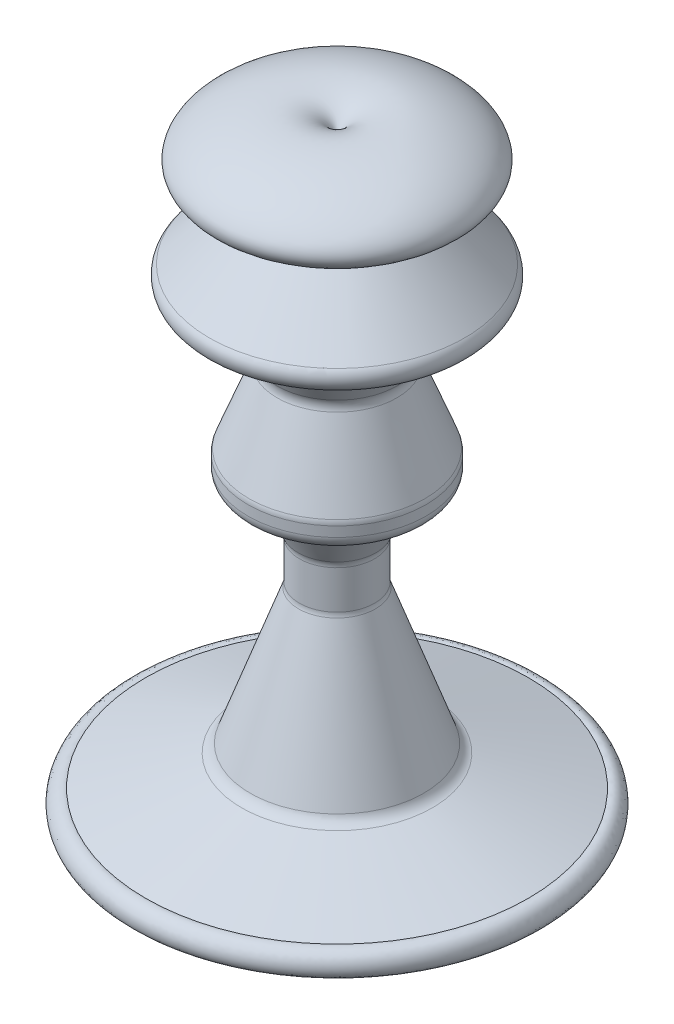
ISO-10303-21;
HEADER;
FILE_DESCRIPTION(('STEP AP214'),'2;1');
FILE_NAME('part.step','',(''),(''),'','','');
FILE_SCHEMA(('AUTOMOTIVE_DESIGN { 1 0 10303 214 1 1 1 1 }'));
ENDSEC;
DATA;
#1=APPLICATION_CONTEXT('core data for automotive mechanical design processes');
#2=APPLICATION_PROTOCOL_DEFINITION('international standard','automotive_design',2000,#1);
#3=PRODUCT_CONTEXT('',#1,'mechanical');
#4=PRODUCT('Part','Part','',(#3));
#5=PRODUCT_RELATED_PRODUCT_CATEGORY('part','',(#4));
#6=PRODUCT_DEFINITION_FORMATION('','',#4);
#7=PRODUCT_DEFINITION_CONTEXT('part definition',#1,'design');
#8=PRODUCT_DEFINITION('design','',#6,#7);
#9=PRODUCT_DEFINITION_SHAPE('','',#8);
#10=(LENGTH_UNIT() NAMED_UNIT(*) SI_UNIT(.MILLI.,.METRE.));
#11=(NAMED_UNIT(*) PLANE_ANGLE_UNIT() SI_UNIT($,.RADIAN.));
#12=(NAMED_UNIT(*) SI_UNIT($,.STERADIAN.) SOLID_ANGLE_UNIT());
#13=UNCERTAINTY_MEASURE_WITH_UNIT(LENGTH_MEASURE(1.E-05),#10,'distance_accuracy_value','');
#14=(GEOMETRIC_REPRESENTATION_CONTEXT(3) GLOBAL_UNCERTAINTY_ASSIGNED_CONTEXT((#13)) GLOBAL_UNIT_ASSIGNED_CONTEXT((#10,
#11,#12)) REPRESENTATION_CONTEXT('',''));
#15=CARTESIAN_POINT('',(0.,0.,0.));
#16=DIRECTION('',(0.,0.,1.));
#17=DIRECTION('',(1.,0.,0.));
#18=AXIS2_PLACEMENT_3D('',#15,#16,#17);
#19=CARTESIAN_POINT('',(12.3714239352477,37.0452322776149,0.));
#20=CARTESIAN_POINT('',(41.0183558371636,39.0587209242621,0.));
#21=CARTESIAN_POINT('',(4.95496067158037,58.3208453663256,0.));
#22=CARTESIAN_POINT('',(0.,45.2019806690164,0.));
#23=B_SPLINE_CURVE_WITH_KNOTS('',3,(#19,#20,#21,#22),.UNSPECIFIED.,.F.,.F.,(4,4),(0.,1.),.UNSPECIFIED.);
#24=CARTESIAN_POINT('',(0.,45.2019806690164,0.));
#25=DIRECTION('',(0.,1.,0.));
#26=AXIS1_PLACEMENT('',#24,#25);
#27=SURFACE_OF_REVOLUTION('',#23,#26);
#28=CARTESIAN_POINT('',(0.,45.2019806690164,0.));
#29=VERTEX_POINT('',#28);
#30=VERTEX_LOOP('',#29);
#31=FACE_BOUND('',#30,.T.);
#32=CARTESIAN_POINT('',(0.,37.0452322776149,0.));
#33=DIRECTION('',(0.,1.,0.));
#34=DIRECTION('',(0.,0.,1.));
#35=AXIS2_PLACEMENT_3D('',#32,#33,#34);
#36=CIRCLE('',#35,12.3714239352477);
#37=CARTESIAN_POINT('',(0.,37.0452322776149,12.3714239352477));
#38=VERTEX_POINT('',#37);
#39=EDGE_CURVE('E49',#38,#38,#36,.T.);
#40=ORIENTED_EDGE('',*,*,#39,.T.);
#41=EDGE_LOOP('',(#40));
#42=FACE_BOUND('',#41,.T.);
#43=ADVANCED_FACE('F33',(#31,#42),#27,.T.);
#44=CARTESIAN_POINT('',(0.,21.3601045228713,0.));
#45=DIRECTION('',(0.,-1.,0.));
#46=DIRECTION('',(0.,0.,-1.));
#47=AXIS2_PLACEMENT_3D('',#44,#45,#46);
#48=CONICAL_SURFACE('',#47,27.0882518979269,0.753559008699903);
#49=CARTESIAN_POINT('',(0.,24.5955746793766,0.));
#50=DIRECTION('',(0.,1.,0.));
#51=DIRECTION('',(0.,0.,1.));
#52=AXIS2_PLACEMENT_3D('',#49,#50,#51);
#53=CIRCLE('',#52,24.0525190421794);
#54=CARTESIAN_POINT('',(0.,24.5955746793766,24.0525190421794));
#55=VERTEX_POINT('',#54);
#56=EDGE_CURVE('E103',#55,#55,#53,.T.);
#57=ORIENTED_EDGE('',*,*,#56,.T.);
#58=EDGE_LOOP('',(#57));
#59=FACE_BOUND('',#58,.T.);
#60=ORIENTED_EDGE('',*,*,#39,.F.);
#61=EDGE_LOOP('',(#60));
#62=FACE_BOUND('',#61,.T.);
#63=ADVANCED_FACE('F45',(#59,#62),#48,.T.);
#64=CARTESIAN_POINT('',(0.,18.6925483969604,0.));
#65=DIRECTION('',(0.,1.,0.));
#66=DIRECTION('',(0.,0.,1.));
#67=AXIS2_PLACEMENT_3D('',#64,#65,#66);
#68=CONICAL_SURFACE('',#67,15.3072552232222,1.34812241459934);
#69=CARTESIAN_POINT('',(0.,18.9642675739927,0.));
#70=DIRECTION('',(0.,1.,0.));
#71=DIRECTION('',(0.,0.,1.));
#72=AXIS2_PLACEMENT_3D('',#69,#70,#71);
#73=CIRCLE('',#72,16.5072759800406);
#74=CARTESIAN_POINT('',(0.,18.9642675739927,16.5072759800406));
#75=VERTEX_POINT('',#74);
#76=EDGE_CURVE('E100',#75,#75,#73,.T.);
#77=ORIENTED_EDGE('',*,*,#76,.T.);
#78=EDGE_LOOP('',(#77));
#79=FACE_BOUND('',#78,.T.);
#80=CARTESIAN_POINT('',(0.,20.380320323477,0.));
#81=DIRECTION('',(0.,-1.,0.));
#82=DIRECTION('',(0.,0.,-1.));
#83=AXIS2_PLACEMENT_3D('',#80,#81,#82);
#84=CIRCLE('',#83,22.761132298503);
#85=CARTESIAN_POINT('',(0.,20.380320323477,-22.761132298503));
#86=VERTEX_POINT('',#85);
#87=EDGE_CURVE('E97',#86,#86,#84,.T.);
#88=ORIENTED_EDGE('',*,*,#87,.T.);
#89=EDGE_LOOP('',(#88));
#90=FACE_BOUND('',#89,.T.);
#91=ADVANCED_FACE('F157',(#79,#90),#68,.T.);
#92=CARTESIAN_POINT('',(0.,9.46227248685522,0.));
#93=DIRECTION('',(0.,1.,0.));
#94=DIRECTION('',(0.,0.,1.));
#95=AXIS2_PLACEMENT_3D('',#92,#93,#94);
#96=CONICAL_SURFACE('',#95,10.8947879920938,0.445928084402635);
#97=CARTESIAN_POINT('',(0.,10.4496816581234,0.));
#98=DIRECTION('',(0.,1.,0.));
#99=DIRECTION('',(0.,0.,1.));
#100=AXIS2_PLACEMENT_3D('',#97,#98,#99);
#101=CIRCLE('',#100,11.3668118681262);
#102=CARTESIAN_POINT('',(0.,10.4496816581234,11.3668118681262));
#103=VERTEX_POINT('',#102);
#104=EDGE_CURVE('E91',#103,#103,#101,.T.);
#105=ORIENTED_EDGE('',*,*,#104,.T.);
#106=EDGE_LOOP('',(#105));
#107=FACE_BOUND('',#106,.T.);
#108=CARTESIAN_POINT('',(0.,17.5824693704544,0.));
#109=DIRECTION('',(0.,1.,0.));
#110=DIRECTION('',(0.,0.,1.));
#111=AXIS2_PLACEMENT_3D('',#108,#109,#110);
#112=CIRCLE('',#111,14.7765899022584);
#113=CARTESIAN_POINT('',(0.,17.5824693704544,14.7765899022584));
#114=VERTEX_POINT('',#113);
#115=EDGE_CURVE('E88',#114,#114,#112,.F.);
#116=ORIENTED_EDGE('',*,*,#115,.T.);
#117=EDGE_LOOP('',(#116));
#118=FACE_BOUND('',#117,.T.);
#119=ADVANCED_FACE('F153',(#107,#118),#96,.T.);
#120=CARTESIAN_POINT('',(0.,-5.77777341018047,0.));
#121=DIRECTION('',(0.,-1.,0.));
#122=DIRECTION('',(0.,0.,-1.));
#123=AXIS2_PLACEMENT_3D('',#120,#121,#122);
#124=CONICAL_SURFACE('',#123,16.7664505680418,0.367751399394681);
#125=CARTESIAN_POINT('',(0.,8.44101541543615,0.));
#126=DIRECTION('',(0.,-1.,0.));
#127=DIRECTION('',(0.,0.,-1.));
#128=AXIS2_PLACEMENT_3D('',#125,#126,#127);
#129=CIRCLE('',#128,11.28825642173);
#130=CARTESIAN_POINT('',(0.,8.44101541543615,-11.28825642173));
#131=VERTEX_POINT('',#130);
#132=EDGE_CURVE('E94',#131,#131,#129,.T.);
#133=ORIENTED_EDGE('',*,*,#132,.T.);
#134=EDGE_LOOP('',(#133));
#135=FACE_BOUND('',#134,.T.);
#136=CARTESIAN_POINT('',(0.,-5.33697754980296,0.));
#137=DIRECTION('',(0.,1.,0.));
#138=DIRECTION('',(0.,0.,1.));
#139=AXIS2_PLACEMENT_3D('',#136,#137,#138);
#140=CIRCLE('',#139,16.5966213841603);
#141=CARTESIAN_POINT('',(0.,-5.33697754980296,16.5966213841603));
#142=VERTEX_POINT('',#141);
#143=EDGE_CURVE('E51',#142,#142,#140,.T.);
#144=ORIENTED_EDGE('',*,*,#143,.T.);
#145=EDGE_LOOP('',(#144));
#146=FACE_BOUND('',#145,.T.);
#147=ADVANCED_FACE('F147',(#135,#146),#124,.T.);
#148=CARTESIAN_POINT('',(0.,45.2019806690164,0.));
#149=DIRECTION('',(0.,1.,0.));
#150=DIRECTION('',(0.,0.,1.));
#151=AXIS2_PLACEMENT_3D('',#148,#149,#150);
#152=CYLINDRICAL_SURFACE('',#151,16.7664505680418);
#153=CARTESIAN_POINT('',(0.,-6.25015349255462,0.));
#154=DIRECTION('',(0.,-1.,0.));
#155=DIRECTION('',(0.,0.,-1.));
#156=AXIS2_PLACEMENT_3D('',#153,#154,#155);
#157=CIRCLE('',#156,16.7664505680418);
#158=CARTESIAN_POINT('',(0.,-6.25015349255462,-16.7664505680418));
#159=VERTEX_POINT('',#158);
#160=EDGE_CURVE('E64',#159,#159,#157,.T.);
#161=ORIENTED_EDGE('',*,*,#160,.T.);
#162=EDGE_LOOP('',(#161));
#163=FACE_BOUND('',#162,.T.);
#164=CARTESIAN_POINT('',(0.,-8.11891558532594,0.));
#165=DIRECTION('',(0.,-1.,0.));
#166=DIRECTION('',(0.,0.,-1.));
#167=AXIS2_PLACEMENT_3D('',#164,#165,#166);
#168=CIRCLE('',#167,16.7664505680418);
#169=CARTESIAN_POINT('',(0.,-8.11891558532594,-16.7664505680418));
#170=VERTEX_POINT('',#169);
#171=EDGE_CURVE('E55',#170,#170,#168,.F.);
#172=ORIENTED_EDGE('',*,*,#171,.T.);
#173=EDGE_LOOP('',(#172));
#174=FACE_BOUND('',#173,.T.);
#175=ADVANCED_FACE('F141',(#163,#174),#152,.T.);
#176=CARTESIAN_POINT('',(0.,-3.06136540092439,0.));
#177=DIRECTION('',(0.,-1.,0.));
#178=DIRECTION('',(0.,0.,-1.));
#179=AXIS2_PLACEMENT_3D('',#176,#177,#178);
#180=CONICAL_SURFACE('',#179,8.99193874139372,0.446123789835747);
#181=CARTESIAN_POINT('',(0.,-9.21485434585816,0.));
#182=DIRECTION('',(0.,1.,0.));
#183=DIRECTION('',(0.,0.,1.));
#184=AXIS2_PLACEMENT_3D('',#181,#182,#183);
#185=CIRCLE('',#184,11.935049635607);
#186=CARTESIAN_POINT('',(0.,-9.21485434585816,11.935049635607));
#187=VERTEX_POINT('',#186);
#188=EDGE_CURVE('E67',#187,#187,#185,.F.);
#189=ORIENTED_EDGE('',*,*,#188,.T.);
#190=EDGE_LOOP('',(#189));
#191=FACE_BOUND('',#190,.T.);
#192=CARTESIAN_POINT('',(0.,-3.06136540092439,0.));
#193=DIRECTION('',(0.,1.,0.));
#194=DIRECTION('',(0.,0.,1.));
#195=AXIS2_PLACEMENT_3D('',#192,#193,#194);
#196=CIRCLE('',#195,8.99193874139372);
#197=CARTESIAN_POINT('',(0.,-3.06136540092439,8.99193874139372));
#198=VERTEX_POINT('',#197);
#199=EDGE_CURVE('E52',#198,#198,#196,.T.);
#200=ORIENTED_EDGE('',*,*,#199,.T.);
#201=EDGE_LOOP('',(#200));
#202=FACE_BOUND('',#201,.T.);
#203=ADVANCED_FACE('F136',(#191,#202),#180,.F.);
#204=CARTESIAN_POINT('',(0.,45.2019806690164,0.));
#205=DIRECTION('',(0.,1.,0.));
#206=DIRECTION('',(0.,0.,1.));
#207=AXIS2_PLACEMENT_3D('',#204,#205,#206);
#208=CYLINDRICAL_SURFACE('',#207,8.99193874139372);
#209=CARTESIAN_POINT('',(0.,-5.80653743170903,0.));
#210=DIRECTION('',(0.,1.,0.));
#211=DIRECTION('',(0.,0.,1.));
#212=AXIS2_PLACEMENT_3D('',#209,#210,#211);
#213=CIRCLE('',#212,8.99193874139372);
#214=CARTESIAN_POINT('',(0.,-5.80653743170903,8.99193874139372));
#215=VERTEX_POINT('',#214);
#216=EDGE_CURVE('E11',#215,#215,#213,.T.);
#217=ORIENTED_EDGE('',*,*,#216,.T.);
#218=EDGE_LOOP('',(#217));
#219=FACE_BOUND('',#218,.T.);
#220=ORIENTED_EDGE('',*,*,#199,.F.);
#221=EDGE_LOOP('',(#220));
#222=FACE_BOUND('',#221,.T.);
#223=ADVANCED_FACE('F126',(#219,#222),#208,.T.);
#224=CARTESIAN_POINT('',(0.,-11.5792137279982,0.));
#225=DIRECTION('',(0.,-1.,0.));
#226=DIRECTION('',(0.,0.,-1.));
#227=AXIS2_PLACEMENT_3D('',#224,#225,#226);
#228=CONICAL_SURFACE('',#227,10.8947879920947,0.342718967164653);
#229=CARTESIAN_POINT('',(0.,-10.5679942486027,0.));
#230=DIRECTION('',(0.,1.,0.));
#231=DIRECTION('',(0.,0.,1.));
#232=AXIS2_PLACEMENT_3D('',#229,#230,#231);
#233=CIRCLE('',#232,10.5339858711463);
#234=CARTESIAN_POINT('',(0.,-10.5679942486027,10.5339858711463));
#235=VERTEX_POINT('',#234);
#236=EDGE_CURVE('E109',#235,#235,#233,.T.);
#237=ORIENTED_EDGE('',*,*,#236,.T.);
#238=EDGE_LOOP('',(#237));
#239=FACE_BOUND('',#238,.T.);
#240=CARTESIAN_POINT('',(0.,-6.66010233688052,0.));
#241=DIRECTION('',(0.,-1.,0.));
#242=DIRECTION('',(0.,0.,-1.));
#243=AXIS2_PLACEMENT_3D('',#240,#241,#242);
#244=CIRCLE('',#243,9.13965386022685);
#245=CARTESIAN_POINT('',(0.,-6.66010233688052,-9.13965386022685));
#246=VERTEX_POINT('',#245);
#247=EDGE_CURVE('E106',#246,#246,#244,.T.);
#248=ORIENTED_EDGE('',*,*,#247,.T.);
#249=EDGE_LOOP('',(#248));
#250=FACE_BOUND('',#249,.T.);
#251=ADVANCED_FACE('F123',(#239,#250),#228,.T.);
#252=CARTESIAN_POINT('',(0.,-19.3164010747751,0.));
#253=DIRECTION('',(0.,1.,0.));
#254=DIRECTION('',(0.,0.,1.));
#255=AXIS2_PLACEMENT_3D('',#252,#253,#254);
#256=CONICAL_SURFACE('',#255,7.08908949069275,0.457123330908594);
#257=CARTESIAN_POINT('',(0.,-12.5426354666406,0.));
#258=DIRECTION('',(0.,-1.,0.));
#259=DIRECTION('',(0.,0.,-1.));
#260=AXIS2_PLACEMENT_3D('',#257,#258,#259);
#261=CIRCLE('',#260,10.4209087252967);
#262=CARTESIAN_POINT('',(0.,-12.5426354666406,-10.4209087252967));
#263=VERTEX_POINT('',#262);
#264=EDGE_CURVE('E40',#263,#263,#261,.T.);
#265=ORIENTED_EDGE('',*,*,#264,.T.);
#266=EDGE_LOOP('',(#265));
#267=FACE_BOUND('',#266,.T.);
#268=CARTESIAN_POINT('',(0.,-18.7861965381579,0.));
#269=DIRECTION('',(0.,1.,0.));
#270=DIRECTION('',(0.,0.,1.));
#271=AXIS2_PLACEMENT_3D('',#268,#269,#270);
#272=CIRCLE('',#271,7.34988175537549);
#273=CARTESIAN_POINT('',(0.,-18.7861965381579,7.34988175537549));
#274=VERTEX_POINT('',#273);
#275=EDGE_CURVE('E85',#274,#274,#272,.T.);
#276=ORIENTED_EDGE('',*,*,#275,.T.);
#277=EDGE_LOOP('',(#276));
#278=FACE_BOUND('',#277,.T.);
#279=ADVANCED_FACE('F114',(#267,#278),#256,.T.);
#280=CARTESIAN_POINT('',(0.,45.2019806690164,0.));
#281=DIRECTION('',(0.,1.,0.));
#282=DIRECTION('',(0.,0.,1.));
#283=AXIS2_PLACEMENT_3D('',#280,#281,#282);
#284=CYLINDRICAL_SURFACE('',#283,7.08908949069275);
#285=CARTESIAN_POINT('',(0.,-27.1553425343592,0.));
#286=DIRECTION('',(0.,1.,0.));
#287=DIRECTION('',(0.,0.,1.));
#288=AXIS2_PLACEMENT_3D('',#285,#286,#287);
#289=CIRCLE('',#288,7.08908949069275);
#290=CARTESIAN_POINT('',(0.,-27.1553425343592,7.08908949069275));
#291=VERTEX_POINT('',#290);
#292=EDGE_CURVE('E79',#291,#291,#289,.T.);
#293=ORIENTED_EDGE('',*,*,#292,.T.);
#294=EDGE_LOOP('',(#293));
#295=FACE_BOUND('',#294,.T.);
#296=CARTESIAN_POINT('',(0.,-19.9072728510242,0.));
#297=DIRECTION('',(0.,1.,0.));
#298=DIRECTION('',(0.,0.,1.));
#299=AXIS2_PLACEMENT_3D('',#296,#297,#298);
#300=CIRCLE('',#299,7.08908949069275);
#301=CARTESIAN_POINT('',(0.,-19.9072728510242,7.08908949069275));
#302=VERTEX_POINT('',#301);
#303=EDGE_CURVE('E76',#302,#302,#300,.F.);
#304=ORIENTED_EDGE('',*,*,#303,.T.);
#305=EDGE_LOOP('',(#304));
#306=FACE_BOUND('',#305,.T.);
#307=ADVANCED_FACE('F197',(#295,#306),#284,.T.);
#308=CARTESIAN_POINT('',(0.,-54.7181871256514,0.));
#309=DIRECTION('',(0.,-1.,0.));
#310=DIRECTION('',(0.,0.,-1.));
#311=AXIS2_PLACEMENT_3D('',#308,#309,#310);
#312=CONICAL_SURFACE('',#311,16.7666494712141,0.342718967164653);
#313=CARTESIAN_POINT('',(0.,-28.0089074395307,0.));
#314=DIRECTION('',(0.,-1.,0.));
#315=DIRECTION('',(0.,0.,-1.));
#316=AXIS2_PLACEMENT_3D('',#313,#314,#315);
#317=CIRCLE('',#316,7.23680460952588);
#318=CARTESIAN_POINT('',(0.,-28.0089074395307,-7.23680460952588));
#319=VERTEX_POINT('',#318);
#320=EDGE_CURVE('E82',#319,#319,#317,.T.);
#321=ORIENTED_EDGE('',*,*,#320,.T.);
#322=EDGE_LOOP('',(#321));
#323=FACE_BOUND('',#322,.T.);
#324=CARTESIAN_POINT('',(0.,-53.5321722784739,0.));
#325=DIRECTION('',(0.,-1.,0.));
#326=DIRECTION('',(0.,0.,-1.));
#327=AXIS2_PLACEMENT_3D('',#324,#325,#326);
#328=CIRCLE('',#327,16.3434805340475);
#329=CARTESIAN_POINT('',(0.,-53.5321722784739,-16.3434805340475));
#330=VERTEX_POINT('',#329);
#331=EDGE_CURVE('E70',#330,#330,#328,.F.);
#332=ORIENTED_EDGE('',*,*,#331,.T.);
#333=EDGE_LOOP('',(#332));
#334=FACE_BOUND('',#333,.T.);
#335=ADVANCED_FACE('F193',(#323,#334),#312,.T.);
#336=CARTESIAN_POINT('',(0.,-60.8357484192025,0.));
#337=DIRECTION('',(0.,-1.,0.));
#338=DIRECTION('',(0.,0.,-1.));
#339=AXIS2_PLACEMENT_3D('',#336,#337,#338);
#340=CONICAL_SURFACE('',#339,36.0256387286897,1.26322921838956);
#341=CARTESIAN_POINT('',(0.,-55.0994126036522,0.));
#342=DIRECTION('',(0.,-1.,0.));
#343=DIRECTION('',(0.,0.,-1.));
#344=AXIS2_PLACEMENT_3D('',#341,#342,#343);
#345=CIRCLE('',#344,17.9668037538092);
#346=CARTESIAN_POINT('',(0.,-55.0994126036522,-17.9668037538092));
#347=VERTEX_POINT('',#346);
#348=EDGE_CURVE('E73',#347,#347,#345,.T.);
#349=ORIENTED_EDGE('',*,*,#348,.T.);
#350=EDGE_LOOP('',(#349));
#351=FACE_BOUND('',#350,.T.);
#352=CARTESIAN_POINT('',(0.,-60.8357484192025,0.));
#353=DIRECTION('',(0.,1.,0.));
#354=DIRECTION('',(0.,0.,1.));
#355=AXIS2_PLACEMENT_3D('',#352,#353,#354);
#356=CIRCLE('',#355,36.0256387286897);
#357=CARTESIAN_POINT('',(0.,-60.8357484192025,36.0256387286897));
#358=VERTEX_POINT('',#357);
#359=EDGE_CURVE('E58',#358,#358,#356,.T.);
#360=ORIENTED_EDGE('',*,*,#359,.T.);
#361=EDGE_LOOP('',(#360));
#362=FACE_BOUND('',#361,.T.);
#363=ADVANCED_FACE('F189',(#351,#362),#340,.T.);
#364=CARTESIAN_POINT('',(36.0256387286897,-65.3672753033144,0.));
#365=CARTESIAN_POINT('',(40.2539694436184,-65.8648477817756,0.));
#366=CARTESIAN_POINT('',(39.016292149259,-60.158578560591,0.));
#367=CARTESIAN_POINT('',(36.0256387286897,-60.8357484192025,0.));
#368=B_SPLINE_CURVE_WITH_KNOTS('',3,(#364,#365,#366,#367),.UNSPECIFIED.,.F.,.F.,(4,4),(0.,1.),.UNSPECIFIED.);
#369=CARTESIAN_POINT('',(0.,45.2019806690164,0.));
#370=DIRECTION('',(0.,1.,0.));
#371=AXIS1_PLACEMENT('',#369,#370);
#372=SURFACE_OF_REVOLUTION('',#368,#371);
#373=ORIENTED_EDGE('',*,*,#359,.F.);
#374=EDGE_LOOP('',(#373));
#375=FACE_BOUND('',#374,.T.);
#376=CARTESIAN_POINT('',(0.,-65.3672753033144,0.));
#377=DIRECTION('',(0.,1.,0.));
#378=DIRECTION('',(0.,0.,1.));
#379=AXIS2_PLACEMENT_3D('',#376,#377,#378);
#380=CIRCLE('',#379,36.0256387286897);
#381=CARTESIAN_POINT('',(0.,-65.3672753033144,36.0256387286897));
#382=VERTEX_POINT('',#381);
#383=EDGE_CURVE('E179',#382,#382,#380,.T.);
#384=ORIENTED_EDGE('',*,*,#383,.T.);
#385=EDGE_LOOP('',(#384));
#386=FACE_BOUND('',#385,.T.);
#387=ADVANCED_FACE('F184',(#375,#386),#372,.T.);
#388=CARTESIAN_POINT('',(0.,-65.3672753033144,0.));
#389=DIRECTION('',(0.,1.,0.));
#390=DIRECTION('',(0.,0.,1.));
#391=AXIS2_PLACEMENT_3D('',#388,#389,#390);
#392=PLANE('',#391);
#393=ORIENTED_EDGE('',*,*,#383,.F.);
#394=EDGE_LOOP('',(#393));
#395=FACE_BOUND('',#394,.T.);
#396=ADVANCED_FACE('F188',(#395),#392,.F.);
#397=CARTESIAN_POINT('',(0.,-6.25015349255462,0.));
#398=DIRECTION('',(0.,-1.,0.));
#399=DIRECTION('',(0.,0.,-1.));
#400=AXIS2_PLACEMENT_3D('',#397,#398,#399);
#401=TOROIDAL_SURFACE('',#400,14.2264505680418,2.54);
#402=ORIENTED_EDGE('',*,*,#160,.F.);
#403=EDGE_LOOP('',(#402));
#404=FACE_BOUND('',#403,.T.);
#405=ORIENTED_EDGE('',*,*,#143,.F.);
#406=EDGE_LOOP('',(#405));
#407=FACE_BOUND('',#406,.T.);
#408=ADVANCED_FACE('F166',(#404,#407),#401,.T.);
#409=CARTESIAN_POINT('',(0.,-8.11891558532594,0.));
#410=DIRECTION('',(0.,-1.,0.));
#411=DIRECTION('',(0.,0.,-1.));
#412=AXIS2_PLACEMENT_3D('',#409,#410,#411);
#413=TOROIDAL_SURFACE('',#412,14.2264505680418,2.54);
#414=ORIENTED_EDGE('',*,*,#188,.F.);
#415=EDGE_LOOP('',(#414));
#416=FACE_BOUND('',#415,.T.);
#417=ORIENTED_EDGE('',*,*,#171,.F.);
#418=EDGE_LOOP('',(#417));
#419=FACE_BOUND('',#418,.T.);
#420=ADVANCED_FACE('F241',(#416,#419),#413,.T.);
#421=CARTESIAN_POINT('',(0.,-52.6786073733024,0.));
#422=DIRECTION('',(0.,1.,0.));
#423=DIRECTION('',(0.,0.,1.));
#424=AXIS2_PLACEMENT_3D('',#421,#422,#423);
#425=TOROIDAL_SURFACE('',#424,18.7357654152144,2.54);
#426=ORIENTED_EDGE('',*,*,#348,.F.);
#427=EDGE_LOOP('',(#426));
#428=FACE_BOUND('',#427,.T.);
#429=ORIENTED_EDGE('',*,*,#331,.F.);
#430=EDGE_LOOP('',(#429));
#431=FACE_BOUND('',#430,.T.);
#432=ADVANCED_FACE('F247',(#428,#431),#425,.F.);
#433=CARTESIAN_POINT('',(0.,-27.1553425343592,0.));
#434=DIRECTION('',(0.,1.,0.));
#435=DIRECTION('',(0.,0.,1.));
#436=AXIS2_PLACEMENT_3D('',#433,#434,#435);
#437=TOROIDAL_SURFACE('',#436,9.62908949069275,2.54);
#438=ORIENTED_EDGE('',*,*,#320,.F.);
#439=EDGE_LOOP('',(#438));
#440=FACE_BOUND('',#439,.T.);
#441=ORIENTED_EDGE('',*,*,#292,.F.);
#442=EDGE_LOOP('',(#441));
#443=FACE_BOUND('',#442,.T.);
#444=ADVANCED_FACE('F253',(#440,#443),#437,.F.);
#445=CARTESIAN_POINT('',(0.,-19.9072728510242,0.));
#446=DIRECTION('',(0.,1.,0.));
#447=DIRECTION('',(0.,0.,1.));
#448=AXIS2_PLACEMENT_3D('',#445,#446,#447);
#449=TOROIDAL_SURFACE('',#448,9.62908949069275,2.54);
#450=ORIENTED_EDGE('',*,*,#303,.F.);
#451=EDGE_LOOP('',(#450));
#452=FACE_BOUND('',#451,.T.);
#453=ORIENTED_EDGE('',*,*,#275,.F.);
#454=EDGE_LOOP('',(#453));
#455=FACE_BOUND('',#454,.T.);
#456=ADVANCED_FACE('F260',(#452,#455),#449,.F.);
#457=CARTESIAN_POINT('',(0.,9.35419135818782,0.));
#458=DIRECTION('',(0.,1.,0.));
#459=DIRECTION('',(0.,0.,1.));
#460=AXIS2_PLACEMENT_3D('',#457,#458,#459);
#461=TOROIDAL_SURFACE('',#460,13.6584272378484,2.54);
#462=ORIENTED_EDGE('',*,*,#132,.F.);
#463=EDGE_LOOP('',(#462));
#464=FACE_BOUND('',#463,.T.);
#465=ORIENTED_EDGE('',*,*,#104,.F.);
#466=EDGE_LOOP('',(#465));
#467=FACE_BOUND('',#466,.T.);
#468=ADVANCED_FACE('F268',(#464,#467),#461,.F.);
#469=CARTESIAN_POINT('',(0.,16.4869790705188,0.));
#470=DIRECTION('',(0.,1.,0.));
#471=DIRECTION('',(0.,0.,1.));
#472=AXIS2_PLACEMENT_3D('',#469,#470,#471);
#473=TOROIDAL_SURFACE('',#472,17.0682052719806,2.54);
#474=ORIENTED_EDGE('',*,*,#115,.F.);
#475=EDGE_LOOP('',(#474));
#476=FACE_BOUND('',#475,.T.);
#477=ORIENTED_EDGE('',*,*,#76,.F.);
#478=EDGE_LOOP('',(#477));
#479=FACE_BOUND('',#478,.T.);
#480=ADVANCED_FACE('F277',(#476,#479),#473,.F.);
#481=CARTESIAN_POINT('',(0.,22.8576088269508,0.));
#482=DIRECTION('',(0.,-1.,0.));
#483=DIRECTION('',(0.,0.,-1.));
#484=AXIS2_PLACEMENT_3D('',#481,#482,#483);
#485=TOROIDAL_SURFACE('',#484,22.200203006563,2.54);
#486=ORIENTED_EDGE('',*,*,#87,.F.);
#487=EDGE_LOOP('',(#486));
#488=FACE_BOUND('',#487,.T.);
#489=ORIENTED_EDGE('',*,*,#56,.F.);
#490=EDGE_LOOP('',(#489));
#491=FACE_BOUND('',#490,.T.);
#492=ADVANCED_FACE('F120',(#488,#491),#485,.T.);
#493=CARTESIAN_POINT('',(0.,-11.4215591537742,0.));
#494=DIRECTION('',(0.,-1.,0.));
#495=DIRECTION('',(0.,0.,-1.));
#496=AXIS2_PLACEMENT_3D('',#493,#494,#495);
#497=TOROIDAL_SURFACE('',#496,8.14170098997944,2.54);
#498=ORIENTED_EDGE('',*,*,#264,.F.);
#499=EDGE_LOOP('',(#498));
#500=FACE_BOUND('',#499,.T.);
#501=ORIENTED_EDGE('',*,*,#236,.F.);
#502=EDGE_LOOP('',(#501));
#503=FACE_BOUND('',#502,.T.);
#504=ADVANCED_FACE('F117',(#500,#503),#497,.T.);
#505=CARTESIAN_POINT('',(0.,-5.80653743170903,0.));
#506=DIRECTION('',(0.,1.,0.));
#507=DIRECTION('',(0.,0.,1.));
#508=AXIS2_PLACEMENT_3D('',#505,#506,#507);
#509=TOROIDAL_SURFACE('',#508,11.5319387413937,2.54);
#510=ORIENTED_EDGE('',*,*,#247,.F.);
#511=EDGE_LOOP('',(#510));
#512=FACE_BOUND('',#511,.T.);
#513=ORIENTED_EDGE('',*,*,#216,.F.);
#514=EDGE_LOOP('',(#513));
#515=FACE_BOUND('',#514,.T.);
#516=ADVANCED_FACE('F35',(#512,#515),#509,.F.);
#517=CLOSED_SHELL('',(#43,#63,#91,#119,#147,#175,#203,#223,#251,#279,#307,#335,#363,#387,#396,
#408,#420,#432,#444,#456,#468,#480,#492,#504,#516));
#518=MANIFOLD_SOLID_BREP('B2',#517);
#519=ADVANCED_BREP_SHAPE_REPRESENTATION('',(#18,#518),#14);
#520=SHAPE_DEFINITION_REPRESENTATION(#9,#519);
ENDSEC;
END-ISO-10303-21;
